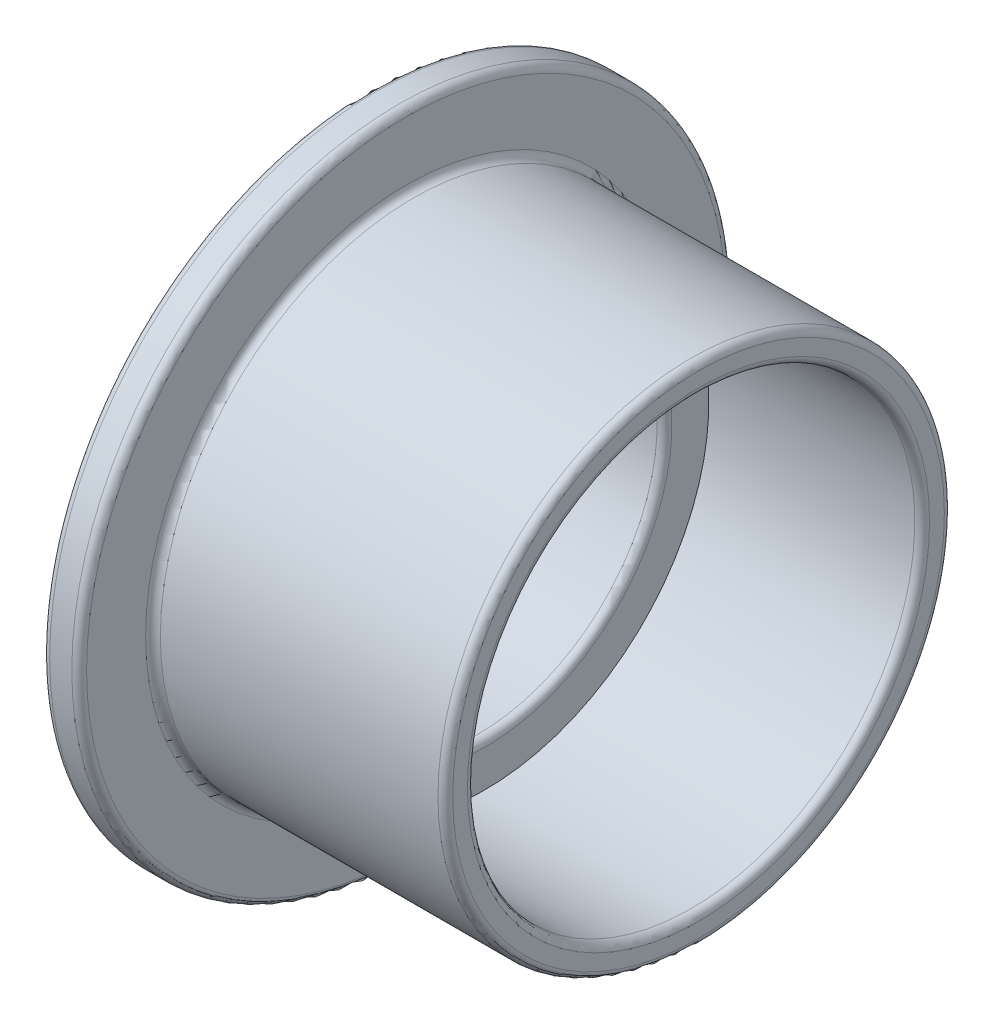
ISO-10303-21;
HEADER;
FILE_DESCRIPTION(('STEP AP214'),'2;1');
FILE_NAME('part.step','',(''),(''),'','','');
FILE_SCHEMA(('AUTOMOTIVE_DESIGN { 1 0 10303 214 1 1 1 1 }'));
ENDSEC;
DATA;
#1=APPLICATION_CONTEXT('core data for automotive mechanical design processes');
#2=APPLICATION_PROTOCOL_DEFINITION('international standard','automotive_design',2000,#1);
#3=PRODUCT_CONTEXT('',#1,'mechanical');
#4=PRODUCT('Part','Part','',(#3));
#5=PRODUCT_RELATED_PRODUCT_CATEGORY('part','',(#4));
#6=PRODUCT_DEFINITION_FORMATION('','',#4);
#7=PRODUCT_DEFINITION_CONTEXT('part definition',#1,'design');
#8=PRODUCT_DEFINITION('design','',#6,#7);
#9=PRODUCT_DEFINITION_SHAPE('','',#8);
#10=(LENGTH_UNIT() NAMED_UNIT(*) SI_UNIT(.MILLI.,.METRE.));
#11=(NAMED_UNIT(*) PLANE_ANGLE_UNIT() SI_UNIT($,.RADIAN.));
#12=(NAMED_UNIT(*) SI_UNIT($,.STERADIAN.) SOLID_ANGLE_UNIT());
#13=UNCERTAINTY_MEASURE_WITH_UNIT(LENGTH_MEASURE(1.E-05),#10,'distance_accuracy_value','');
#14=(GEOMETRIC_REPRESENTATION_CONTEXT(3) GLOBAL_UNCERTAINTY_ASSIGNED_CONTEXT((#13)) GLOBAL_UNIT_ASSIGNED_CONTEXT((#10,
#11,#12)) REPRESENTATION_CONTEXT('',''));
#15=CARTESIAN_POINT('',(0.,0.,0.));
#16=DIRECTION('',(0.,0.,1.));
#17=DIRECTION('',(1.,0.,0.));
#18=AXIS2_PLACEMENT_3D('',#15,#16,#17);
#19=CARTESIAN_POINT('',(-30.8496386192104,0.,0.));
#20=DIRECTION('',(-1.,0.,0.));
#21=DIRECTION('',(0.,0.,1.));
#22=AXIS2_PLACEMENT_3D('',#19,#20,#21);
#23=CYLINDRICAL_SURFACE('',#22,22.15);
#24=CARTESIAN_POINT('',(-10.5,0.,0.));
#25=DIRECTION('',(-1.,0.,0.));
#26=DIRECTION('',(0.,0.,1.));
#27=AXIS2_PLACEMENT_3D('',#24,#25,#26);
#28=CIRCLE('',#27,22.15);
#29=CARTESIAN_POINT('',(-10.5,0.,22.15));
#30=VERTEX_POINT('',#29);
#31=EDGE_CURVE('E75',#30,#30,#28,.T.);
#32=ORIENTED_EDGE('',*,*,#31,.T.);
#33=EDGE_LOOP('',(#32));
#34=FACE_BOUND('',#33,.T.);
#35=CARTESIAN_POINT('',(-12.,0.,0.));
#36=DIRECTION('',(1.,0.,0.));
#37=DIRECTION('',(0.,0.,-1.));
#38=AXIS2_PLACEMENT_3D('',#35,#36,#37);
#39=CIRCLE('',#38,22.15);
#40=CARTESIAN_POINT('',(-12.,0.,-22.15));
#41=VERTEX_POINT('',#40);
#42=EDGE_CURVE('E78',#41,#41,#39,.T.);
#43=ORIENTED_EDGE('',*,*,#42,.T.);
#44=EDGE_LOOP('',(#43));
#45=FACE_BOUND('',#44,.T.);
#46=ADVANCED_FACE('F31',(#34,#45),#23,.T.);
#47=CARTESIAN_POINT('',(-12.5,22.15,0.));
#48=DIRECTION('',(1.,0.,0.));
#49=DIRECTION('',(0.,0.,-1.));
#50=AXIS2_PLACEMENT_3D('',#47,#48,#49);
#51=PLANE('',#50);
#52=CARTESIAN_POINT('',(-12.5,0.,0.));
#53=DIRECTION('',(1.,0.,0.));
#54=DIRECTION('',(0.,0.,-1.));
#55=AXIS2_PLACEMENT_3D('',#52,#53,#54);
#56=CIRCLE('',#55,21.65);
#57=CARTESIAN_POINT('',(-12.5,0.,-21.65));
#58=VERTEX_POINT('',#57);
#59=EDGE_CURVE('E63',#58,#58,#56,.F.);
#60=ORIENTED_EDGE('',*,*,#59,.T.);
#61=EDGE_LOOP('',(#60));
#62=FACE_BOUND('',#61,.T.);
#63=CARTESIAN_POINT('',(-12.5,0.,0.));
#64=DIRECTION('',(1.,0.,0.));
#65=DIRECTION('',(0.,0.,-1.));
#66=AXIS2_PLACEMENT_3D('',#63,#64,#65);
#67=CIRCLE('',#66,12.65);
#68=CARTESIAN_POINT('',(-12.5,0.,-12.65));
#69=VERTEX_POINT('',#68);
#70=EDGE_CURVE('E66',#69,#69,#67,.T.);
#71=ORIENTED_EDGE('',*,*,#70,.T.);
#72=EDGE_LOOP('',(#71));
#73=FACE_BOUND('',#72,.T.);
#74=ADVANCED_FACE('F98',(#62,#73),#51,.F.);
#75=CARTESIAN_POINT('',(-30.8496386192104,0.,0.));
#76=DIRECTION('',(-1.,0.,0.));
#77=DIRECTION('',(0.,0.,1.));
#78=AXIS2_PLACEMENT_3D('',#75,#76,#77);
#79=CYLINDRICAL_SURFACE('',#78,12.15);
#80=CARTESIAN_POINT('',(-12.,0.,0.));
#81=DIRECTION('',(1.,0.,0.));
#82=DIRECTION('',(0.,0.,-1.));
#83=AXIS2_PLACEMENT_3D('',#80,#81,#82);
#84=CIRCLE('',#83,12.15);
#85=CARTESIAN_POINT('',(-12.,0.,-12.15));
#86=VERTEX_POINT('',#85);
#87=EDGE_CURVE('E57',#86,#86,#84,.F.);
#88=ORIENTED_EDGE('',*,*,#87,.T.);
#89=EDGE_LOOP('',(#88));
#90=FACE_BOUND('',#89,.T.);
#91=CARTESIAN_POINT('',(-5.15,0.,0.));
#92=DIRECTION('',(-1.,0.,0.));
#93=DIRECTION('',(0.,0.,1.));
#94=AXIS2_PLACEMENT_3D('',#91,#92,#93);
#95=CIRCLE('',#94,12.15);
#96=CARTESIAN_POINT('',(-5.15,0.,12.15));
#97=VERTEX_POINT('',#96);
#98=EDGE_CURVE('E60',#97,#97,#95,.F.);
#99=ORIENTED_EDGE('',*,*,#98,.T.);
#100=EDGE_LOOP('',(#99));
#101=FACE_BOUND('',#100,.T.);
#102=ADVANCED_FACE('F89',(#90,#101),#79,.F.);
#103=CARTESIAN_POINT('',(-4.65,12.15,0.));
#104=DIRECTION('',(-1.,0.,0.));
#105=DIRECTION('',(0.,0.,1.));
#106=AXIS2_PLACEMENT_3D('',#103,#104,#105);
#107=PLANE('',#106);
#108=CARTESIAN_POINT('',(-4.65,0.,0.));
#109=DIRECTION('',(-1.,0.,0.));
#110=DIRECTION('',(0.,0.,1.));
#111=AXIS2_PLACEMENT_3D('',#108,#109,#110);
#112=CIRCLE('',#111,12.65);
#113=CARTESIAN_POINT('',(-4.65,0.,12.65));
#114=VERTEX_POINT('',#113);
#115=EDGE_CURVE('E54',#114,#114,#112,.T.);
#116=ORIENTED_EDGE('',*,*,#115,.T.);
#117=EDGE_LOOP('',(#116));
#118=FACE_BOUND('',#117,.T.);
#119=CARTESIAN_POINT('',(-4.65,0.,0.));
#120=DIRECTION('',(-1.,0.,0.));
#121=DIRECTION('',(0.,0.,1.));
#122=AXIS2_PLACEMENT_3D('',#119,#120,#121);
#123=CIRCLE('',#122,15.15);
#124=CARTESIAN_POINT('',(-4.65,0.,15.15));
#125=VERTEX_POINT('',#124);
#126=EDGE_CURVE('E81',#125,#125,#123,.T.);
#127=ORIENTED_EDGE('',*,*,#126,.F.);
#128=EDGE_LOOP('',(#127));
#129=FACE_BOUND('',#128,.T.);
#130=ADVANCED_FACE('F87',(#118,#129),#107,.F.);
#131=CARTESIAN_POINT('',(-30.8496386192104,0.,0.));
#132=DIRECTION('',(-1.,0.,0.));
#133=DIRECTION('',(0.,0.,1.));
#134=AXIS2_PLACEMENT_3D('',#131,#132,#133);
#135=CYLINDRICAL_SURFACE('',#134,15.15);
#136=CARTESIAN_POINT('',(9.3,0.,0.));
#137=DIRECTION('',(-1.,0.,0.));
#138=DIRECTION('',(0.,0.,1.));
#139=AXIS2_PLACEMENT_3D('',#136,#137,#138);
#140=CIRCLE('',#139,15.15);
#141=CARTESIAN_POINT('',(9.3,0.,15.15));
#142=VERTEX_POINT('',#141);
#143=EDGE_CURVE('E10',#142,#142,#140,.F.);
#144=ORIENTED_EDGE('',*,*,#143,.T.);
#145=EDGE_LOOP('',(#144));
#146=FACE_BOUND('',#145,.T.);
#147=ORIENTED_EDGE('',*,*,#126,.T.);
#148=EDGE_LOOP('',(#147));
#149=FACE_BOUND('',#148,.T.);
#150=ADVANCED_FACE('F85',(#146,#149),#135,.F.);
#151=CARTESIAN_POINT('',(9.8,15.15,0.));
#152=DIRECTION('',(-1.,0.,0.));
#153=DIRECTION('',(0.,0.,1.));
#154=AXIS2_PLACEMENT_3D('',#151,#152,#153);
#155=PLANE('',#154);
#156=CARTESIAN_POINT('',(9.8,0.,0.));
#157=DIRECTION('',(-1.,0.,0.));
#158=DIRECTION('',(0.,0.,1.));
#159=AXIS2_PLACEMENT_3D('',#156,#157,#158);
#160=CIRCLE('',#159,16.65);
#161=CARTESIAN_POINT('',(9.8,0.,16.65));
#162=VERTEX_POINT('',#161);
#163=EDGE_CURVE('E38',#162,#162,#160,.F.);
#164=ORIENTED_EDGE('',*,*,#163,.T.);
#165=EDGE_LOOP('',(#164));
#166=FACE_BOUND('',#165,.T.);
#167=CARTESIAN_POINT('',(9.8,0.,0.));
#168=DIRECTION('',(-1.,0.,0.));
#169=DIRECTION('',(0.,0.,1.));
#170=AXIS2_PLACEMENT_3D('',#167,#168,#169);
#171=CIRCLE('',#170,15.65);
#172=CARTESIAN_POINT('',(9.8,0.,15.65));
#173=VERTEX_POINT('',#172);
#174=EDGE_CURVE('E42',#173,#173,#171,.T.);
#175=ORIENTED_EDGE('',*,*,#174,.T.);
#176=EDGE_LOOP('',(#175));
#177=FACE_BOUND('',#176,.T.);
#178=ADVANCED_FACE('F96',(#166,#177),#155,.F.);
#179=CARTESIAN_POINT('',(-30.8496386192104,0.,0.));
#180=DIRECTION('',(-1.,0.,0.));
#181=DIRECTION('',(0.,0.,1.));
#182=AXIS2_PLACEMENT_3D('',#179,#180,#181);
#183=CYLINDRICAL_SURFACE('',#182,17.15);
#184=CARTESIAN_POINT('',(9.3,0.,0.));
#185=DIRECTION('',(-1.,0.,0.));
#186=DIRECTION('',(0.,0.,1.));
#187=AXIS2_PLACEMENT_3D('',#184,#185,#186);
#188=CIRCLE('',#187,17.15);
#189=CARTESIAN_POINT('',(9.3,0.,17.15));
#190=VERTEX_POINT('',#189);
#191=EDGE_CURVE('E46',#190,#190,#188,.T.);
#192=ORIENTED_EDGE('',*,*,#191,.T.);
#193=EDGE_LOOP('',(#192));
#194=FACE_BOUND('',#193,.T.);
#195=CARTESIAN_POINT('',(-9.5,0.,0.));
#196=DIRECTION('',(-1.,0.,0.));
#197=DIRECTION('',(0.,0.,1.));
#198=AXIS2_PLACEMENT_3D('',#195,#196,#197);
#199=CIRCLE('',#198,17.15);
#200=CARTESIAN_POINT('',(-9.5,0.,17.15));
#201=VERTEX_POINT('',#200);
#202=EDGE_CURVE('E51',#201,#201,#199,.F.);
#203=ORIENTED_EDGE('',*,*,#202,.T.);
#204=EDGE_LOOP('',(#203));
#205=FACE_BOUND('',#204,.T.);
#206=ADVANCED_FACE('F143',(#194,#205),#183,.T.);
#207=CARTESIAN_POINT('',(-10.,17.15,0.));
#208=DIRECTION('',(-1.,0.,0.));
#209=DIRECTION('',(0.,0.,1.));
#210=AXIS2_PLACEMENT_3D('',#207,#208,#209);
#211=PLANE('',#210);
#212=CARTESIAN_POINT('',(-10.,0.,0.));
#213=DIRECTION('',(-1.,0.,0.));
#214=DIRECTION('',(0.,0.,1.));
#215=AXIS2_PLACEMENT_3D('',#212,#213,#214);
#216=CIRCLE('',#215,21.65);
#217=CARTESIAN_POINT('',(-10.,0.,21.65));
#218=VERTEX_POINT('',#217);
#219=EDGE_CURVE('E69',#218,#218,#216,.F.);
#220=ORIENTED_EDGE('',*,*,#219,.T.);
#221=EDGE_LOOP('',(#220));
#222=FACE_BOUND('',#221,.T.);
#223=CARTESIAN_POINT('',(-10.,0.,0.));
#224=DIRECTION('',(-1.,0.,0.));
#225=DIRECTION('',(0.,0.,1.));
#226=AXIS2_PLACEMENT_3D('',#223,#224,#225);
#227=CIRCLE('',#226,17.65);
#228=CARTESIAN_POINT('',(-10.,0.,17.65));
#229=VERTEX_POINT('',#228);
#230=EDGE_CURVE('E72',#229,#229,#227,.T.);
#231=ORIENTED_EDGE('',*,*,#230,.T.);
#232=EDGE_LOOP('',(#231));
#233=FACE_BOUND('',#232,.T.);
#234=ADVANCED_FACE('F115',(#222,#233),#211,.F.);
#235=CARTESIAN_POINT('',(-10.5,0.,0.));
#236=DIRECTION('',(-1.,0.,0.));
#237=DIRECTION('',(0.,0.,1.));
#238=AXIS2_PLACEMENT_3D('',#235,#236,#237);
#239=TOROIDAL_SURFACE('',#238,21.65,0.5);
#240=ORIENTED_EDGE('',*,*,#219,.F.);
#241=EDGE_LOOP('',(#240));
#242=FACE_BOUND('',#241,.T.);
#243=ORIENTED_EDGE('',*,*,#31,.F.);
#244=EDGE_LOOP('',(#243));
#245=FACE_BOUND('',#244,.T.);
#246=ADVANCED_FACE('F111',(#242,#245),#239,.T.);
#247=CARTESIAN_POINT('',(-12.,0.,0.));
#248=DIRECTION('',(1.,0.,0.));
#249=DIRECTION('',(0.,0.,-1.));
#250=AXIS2_PLACEMENT_3D('',#247,#248,#249);
#251=TOROIDAL_SURFACE('',#250,21.65,0.5);
#252=ORIENTED_EDGE('',*,*,#42,.F.);
#253=EDGE_LOOP('',(#252));
#254=FACE_BOUND('',#253,.T.);
#255=ORIENTED_EDGE('',*,*,#59,.F.);
#256=EDGE_LOOP('',(#255));
#257=FACE_BOUND('',#256,.T.);
#258=ADVANCED_FACE('F114',(#254,#257),#251,.T.);
#259=CARTESIAN_POINT('',(-12.,0.,0.));
#260=DIRECTION('',(1.,0.,0.));
#261=DIRECTION('',(0.,0.,-1.));
#262=AXIS2_PLACEMENT_3D('',#259,#260,#261);
#263=TOROIDAL_SURFACE('',#262,12.65,0.5);
#264=ORIENTED_EDGE('',*,*,#70,.F.);
#265=EDGE_LOOP('',(#264));
#266=FACE_BOUND('',#265,.T.);
#267=ORIENTED_EDGE('',*,*,#87,.F.);
#268=EDGE_LOOP('',(#267));
#269=FACE_BOUND('',#268,.T.);
#270=ADVANCED_FACE('F119',(#266,#269),#263,.T.);
#271=CARTESIAN_POINT('',(-5.15,0.,0.));
#272=DIRECTION('',(-1.,0.,0.));
#273=DIRECTION('',(0.,0.,1.));
#274=AXIS2_PLACEMENT_3D('',#271,#272,#273);
#275=TOROIDAL_SURFACE('',#274,12.65,0.5);
#276=ORIENTED_EDGE('',*,*,#98,.F.);
#277=EDGE_LOOP('',(#276));
#278=FACE_BOUND('',#277,.T.);
#279=ORIENTED_EDGE('',*,*,#115,.F.);
#280=EDGE_LOOP('',(#279));
#281=FACE_BOUND('',#280,.T.);
#282=ADVANCED_FACE('F123',(#278,#281),#275,.T.);
#283=CARTESIAN_POINT('',(9.3,0.,0.));
#284=DIRECTION('',(-1.,0.,0.));
#285=DIRECTION('',(0.,0.,1.));
#286=AXIS2_PLACEMENT_3D('',#283,#284,#285);
#287=TOROIDAL_SURFACE('',#286,16.65,0.5);
#288=ORIENTED_EDGE('',*,*,#163,.F.);
#289=EDGE_LOOP('',(#288));
#290=FACE_BOUND('',#289,.T.);
#291=ORIENTED_EDGE('',*,*,#191,.F.);
#292=EDGE_LOOP('',(#291));
#293=FACE_BOUND('',#292,.T.);
#294=ADVANCED_FACE('F127',(#290,#293),#287,.T.);
#295=CARTESIAN_POINT('',(-9.5,0.,0.));
#296=DIRECTION('',(-1.,0.,0.));
#297=DIRECTION('',(0.,0.,1.));
#298=AXIS2_PLACEMENT_3D('',#295,#296,#297);
#299=TOROIDAL_SURFACE('',#298,17.65,0.5);
#300=ORIENTED_EDGE('',*,*,#202,.F.);
#301=EDGE_LOOP('',(#300));
#302=FACE_BOUND('',#301,.T.);
#303=ORIENTED_EDGE('',*,*,#230,.F.);
#304=EDGE_LOOP('',(#303));
#305=FACE_BOUND('',#304,.T.);
#306=ADVANCED_FACE('F130',(#302,#305),#299,.F.);
#307=CARTESIAN_POINT('',(9.3,0.,0.));
#308=DIRECTION('',(-1.,0.,0.));
#309=DIRECTION('',(0.,0.,1.));
#310=AXIS2_PLACEMENT_3D('',#307,#308,#309);
#311=TOROIDAL_SURFACE('',#310,15.65,0.5);
#312=ORIENTED_EDGE('',*,*,#143,.F.);
#313=EDGE_LOOP('',(#312));
#314=FACE_BOUND('',#313,.T.);
#315=ORIENTED_EDGE('',*,*,#174,.F.);
#316=EDGE_LOOP('',(#315));
#317=FACE_BOUND('',#316,.T.);
#318=ADVANCED_FACE('F33',(#314,#317),#311,.T.);
#319=CLOSED_SHELL('',(#46,#74,#102,#130,#150,#178,#206,#234,#246,#258,#270,#282,#294,#306,#318));
#320=MANIFOLD_SOLID_BREP('B2',#319);
#321=ADVANCED_BREP_SHAPE_REPRESENTATION('',(#18,#320),#14);
#322=SHAPE_DEFINITION_REPRESENTATION(#9,#321);
ENDSEC;
END-ISO-10303-21;
